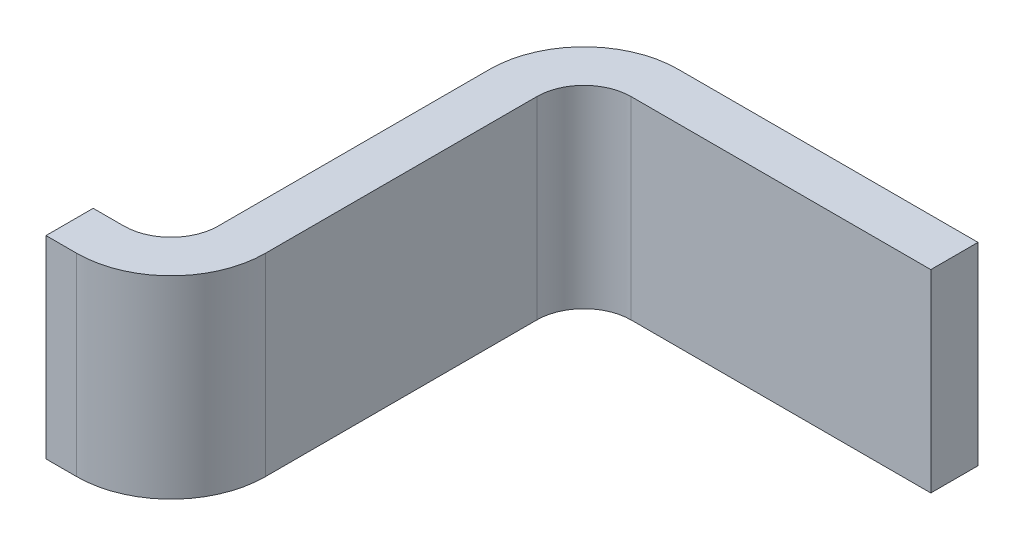
ISO-10303-21;
HEADER;
FILE_DESCRIPTION(('STEP AP214'),'2;1');
FILE_NAME('part.step','',(''),(''),'','','');
FILE_SCHEMA(('AUTOMOTIVE_DESIGN { 1 0 10303 214 1 1 1 1 }'));
ENDSEC;
DATA;
#1=APPLICATION_CONTEXT('core data for automotive mechanical design processes');
#2=APPLICATION_PROTOCOL_DEFINITION('international standard','automotive_design',2000,#1);
#3=PRODUCT_CONTEXT('',#1,'mechanical');
#4=PRODUCT('Part','Part','',(#3));
#5=PRODUCT_RELATED_PRODUCT_CATEGORY('part','',(#4));
#6=PRODUCT_DEFINITION_FORMATION('','',#4);
#7=PRODUCT_DEFINITION_CONTEXT('part definition',#1,'design');
#8=PRODUCT_DEFINITION('design','',#6,#7);
#9=PRODUCT_DEFINITION_SHAPE('','',#8);
#10=(LENGTH_UNIT() NAMED_UNIT(*) SI_UNIT(.MILLI.,.METRE.));
#11=(NAMED_UNIT(*) PLANE_ANGLE_UNIT() SI_UNIT($,.RADIAN.));
#12=(NAMED_UNIT(*) SI_UNIT($,.STERADIAN.) SOLID_ANGLE_UNIT());
#13=UNCERTAINTY_MEASURE_WITH_UNIT(LENGTH_MEASURE(1.E-05),#10,'distance_accuracy_value','');
#14=(GEOMETRIC_REPRESENTATION_CONTEXT(3) GLOBAL_UNCERTAINTY_ASSIGNED_CONTEXT((#13)) GLOBAL_UNIT_ASSIGNED_CONTEXT((#10,
#11,#12)) REPRESENTATION_CONTEXT('',''));
#15=CARTESIAN_POINT('',(0.,0.,0.));
#16=DIRECTION('',(0.,0.,1.));
#17=DIRECTION('',(1.,0.,0.));
#18=AXIS2_PLACEMENT_3D('',#15,#16,#17);
#19=CARTESIAN_POINT('',(0.,0.205,0.975));
#20=DIRECTION('',(0.,0.,-1.));
#21=DIRECTION('',(-1.,0.,0.));
#22=AXIS2_PLACEMENT_3D('',#19,#20,#21);
#23=PLANE('',#22);
#24=DIRECTION('',(1.,0.,0.));
#25=VECTOR('',#24,1.);
#26=CARTESIAN_POINT('',(0.,0.205,0.975));
#27=LINE('',#26,#25);
#28=CARTESIAN_POINT('',(0.065,0.205,0.975));
#29=VERTEX_POINT('',#28);
#30=CARTESIAN_POINT('',(0.,0.205,0.975));
#31=VERTEX_POINT('',#30);
#32=EDGE_CURVE('E104',#29,#31,#27,.F.);
#33=ORIENTED_EDGE('',*,*,#32,.T.);
#34=DIRECTION('',(0.,1.,0.));
#35=VECTOR('',#34,1.);
#36=CARTESIAN_POINT('',(0.,-0.205,0.975));
#37=LINE('',#36,#35);
#38=CARTESIAN_POINT('',(0.,-0.205,0.975));
#39=VERTEX_POINT('',#38);
#40=EDGE_CURVE('E113',#39,#31,#37,.T.);
#41=ORIENTED_EDGE('',*,*,#40,.F.);
#42=DIRECTION('',(1.,0.,0.));
#43=VECTOR('',#42,1.);
#44=CARTESIAN_POINT('',(0.,-0.205,0.975));
#45=LINE('',#44,#43);
#46=CARTESIAN_POINT('',(0.065,-0.205,0.975));
#47=VERTEX_POINT('',#46);
#48=EDGE_CURVE('E118',#39,#47,#45,.T.);
#49=ORIENTED_EDGE('',*,*,#48,.T.);
#50=DIRECTION('',(0.,1.,0.));
#51=VECTOR('',#50,1.);
#52=CARTESIAN_POINT('',(0.065,0.205,0.975));
#53=LINE('',#52,#51);
#54=EDGE_CURVE('E116',#29,#47,#53,.F.);
#55=ORIENTED_EDGE('',*,*,#54,.F.);
#56=EDGE_LOOP('',(#33,#41,#49,#55));
#57=FACE_BOUND('',#56,.T.);
#58=ADVANCED_FACE('F17',(#57),#23,.F.);
#59=CARTESIAN_POINT('',(0.,-0.205,0.875));
#60=DIRECTION('',(-1.,0.,0.));
#61=DIRECTION('',(0.,0.,1.));
#62=AXIS2_PLACEMENT_3D('',#59,#60,#61);
#63=PLANE('',#62);
#64=DIRECTION('',(0.,0.,1.));
#65=VECTOR('',#64,1.);
#66=CARTESIAN_POINT('',(0.,0.205,0.875));
#67=LINE('',#66,#65);
#68=CARTESIAN_POINT('',(0.,0.205,0.875));
#69=VERTEX_POINT('',#68);
#70=EDGE_CURVE('E111',#31,#69,#67,.F.);
#71=ORIENTED_EDGE('',*,*,#70,.T.);
#72=DIRECTION('',(0.,1.,0.));
#73=VECTOR('',#72,1.);
#74=CARTESIAN_POINT('',(0.,-0.205,0.875));
#75=LINE('',#74,#73);
#76=CARTESIAN_POINT('',(0.,-0.205,0.875));
#77=VERTEX_POINT('',#76);
#78=EDGE_CURVE('E127',#69,#77,#75,.F.);
#79=ORIENTED_EDGE('',*,*,#78,.T.);
#80=DIRECTION('',(0.,0.,1.));
#81=VECTOR('',#80,1.);
#82=CARTESIAN_POINT('',(0.,-0.205,0.975));
#83=LINE('',#82,#81);
#84=EDGE_CURVE('E140',#77,#39,#83,.T.);
#85=ORIENTED_EDGE('',*,*,#84,.T.);
#86=ORIENTED_EDGE('',*,*,#40,.T.);
#87=EDGE_LOOP('',(#71,#79,#85,#86));
#88=FACE_BOUND('',#87,.T.);
#89=ADVANCED_FACE('F277',(#88),#63,.T.);
#90=CARTESIAN_POINT('',(0.065,0.205,0.775));
#91=DIRECTION('',(0.,1.,0.));
#92=DIRECTION('',(0.,0.,1.));
#93=AXIS2_PLACEMENT_3D('',#90,#91,#92);
#94=CYLINDRICAL_SURFACE('',#93,0.2);
#95=CARTESIAN_POINT('',(0.065,0.205,0.775));
#96=DIRECTION('',(0.,1.,0.));
#97=DIRECTION('',(0.,0.,1.));
#98=AXIS2_PLACEMENT_3D('',#95,#96,#97);
#99=CIRCLE('',#98,0.2);
#100=CARTESIAN_POINT('',(0.265,0.205,0.775));
#101=VERTEX_POINT('',#100);
#102=EDGE_CURVE('E20',#29,#101,#99,.T.);
#103=ORIENTED_EDGE('',*,*,#102,.F.);
#104=ORIENTED_EDGE('',*,*,#54,.T.);
#105=CARTESIAN_POINT('',(0.065,-0.205,0.775));
#106=DIRECTION('',(0.,1.,0.));
#107=DIRECTION('',(0.,0.,1.));
#108=AXIS2_PLACEMENT_3D('',#105,#106,#107);
#109=CIRCLE('',#108,0.2);
#110=CARTESIAN_POINT('',(0.265,-0.205,0.775));
#111=VERTEX_POINT('',#110);
#112=EDGE_CURVE('E178',#111,#47,#109,.F.);
#113=ORIENTED_EDGE('',*,*,#112,.F.);
#114=DIRECTION('',(0.,1.,0.));
#115=VECTOR('',#114,1.);
#116=CARTESIAN_POINT('',(0.265,0.205,0.775));
#117=LINE('',#116,#115);
#118=EDGE_CURVE('E124',#111,#101,#117,.T.);
#119=ORIENTED_EDGE('',*,*,#118,.T.);
#120=EDGE_LOOP('',(#103,#104,#113,#119));
#121=FACE_BOUND('',#120,.T.);
#122=ADVANCED_FACE('F123',(#121),#94,.T.);
#123=CARTESIAN_POINT('',(0.,-0.205,0.875));
#124=DIRECTION('',(0.,0.,1.));
#125=DIRECTION('',(1.,0.,0.));
#126=AXIS2_PLACEMENT_3D('',#123,#124,#125);
#127=PLANE('',#126);
#128=DIRECTION('',(1.,0.,0.));
#129=VECTOR('',#128,1.);
#130=CARTESIAN_POINT('',(0.,-0.205,0.875));
#131=LINE('',#130,#129);
#132=CARTESIAN_POINT('',(0.065,-0.205,0.875));
#133=VERTEX_POINT('',#132);
#134=EDGE_CURVE('E131',#77,#133,#131,.T.);
#135=ORIENTED_EDGE('',*,*,#134,.F.);
#136=ORIENTED_EDGE('',*,*,#78,.F.);
#137=DIRECTION('',(1.,0.,0.));
#138=VECTOR('',#137,1.);
#139=CARTESIAN_POINT('',(0.,0.205,0.875));
#140=LINE('',#139,#138);
#141=CARTESIAN_POINT('',(0.065,0.205,0.875));
#142=VERTEX_POINT('',#141);
#143=EDGE_CURVE('E126',#142,#69,#140,.F.);
#144=ORIENTED_EDGE('',*,*,#143,.F.);
#145=DIRECTION('',(0.,1.,0.));
#146=VECTOR('',#145,1.);
#147=CARTESIAN_POINT('',(0.065,-0.205,0.875));
#148=LINE('',#147,#146);
#149=EDGE_CURVE('E175',#142,#133,#148,.F.);
#150=ORIENTED_EDGE('',*,*,#149,.T.);
#151=EDGE_LOOP('',(#135,#136,#144,#150));
#152=FACE_BOUND('',#151,.T.);
#153=ADVANCED_FACE('F271',(#152),#127,.F.);
#154=CARTESIAN_POINT('',(0.265,0.205,0.775));
#155=DIRECTION('',(-1.,0.,0.));
#156=DIRECTION('',(0.,0.,1.));
#157=AXIS2_PLACEMENT_3D('',#154,#155,#156);
#158=PLANE('',#157);
#159=DIRECTION('',(0.,0.,-1.));
#160=VECTOR('',#159,1.);
#161=CARTESIAN_POINT('',(0.265,0.205,0.775));
#162=LINE('',#161,#160);
#163=CARTESIAN_POINT('',(0.265,0.205,0.2));
#164=VERTEX_POINT('',#163);
#165=EDGE_CURVE('E177',#164,#101,#162,.F.);
#166=ORIENTED_EDGE('',*,*,#165,.T.);
#167=ORIENTED_EDGE('',*,*,#118,.F.);
#168=DIRECTION('',(0.,0.,1.));
#169=VECTOR('',#168,1.);
#170=CARTESIAN_POINT('',(0.265,-0.205,0.775));
#171=LINE('',#170,#169);
#172=CARTESIAN_POINT('',(0.265,-0.205,0.2));
#173=VERTEX_POINT('',#172);
#174=EDGE_CURVE('E174',#111,#173,#171,.F.);
#175=ORIENTED_EDGE('',*,*,#174,.T.);
#176=DIRECTION('',(0.,-1.,0.));
#177=VECTOR('',#176,1.);
#178=CARTESIAN_POINT('',(0.265,0.205,0.2));
#179=LINE('',#178,#177);
#180=EDGE_CURVE('E171',#173,#164,#179,.F.);
#181=ORIENTED_EDGE('',*,*,#180,.T.);
#182=EDGE_LOOP('',(#166,#167,#175,#181));
#183=FACE_BOUND('',#182,.T.);
#184=ADVANCED_FACE('F267',(#183),#158,.F.);
#185=CARTESIAN_POINT('',(0.065,-0.205,0.775));
#186=DIRECTION('',(0.,1.,0.));
#187=DIRECTION('',(0.,0.,1.));
#188=AXIS2_PLACEMENT_3D('',#185,#186,#187);
#189=CYLINDRICAL_SURFACE('',#188,0.1);
#190=CARTESIAN_POINT('',(0.065,-0.205,0.775));
#191=DIRECTION('',(0.,1.,0.));
#192=DIRECTION('',(0.,0.,1.));
#193=AXIS2_PLACEMENT_3D('',#190,#191,#192);
#194=CIRCLE('',#193,0.1);
#195=CARTESIAN_POINT('',(0.165,-0.205,0.775));
#196=VERTEX_POINT('',#195);
#197=EDGE_CURVE('E172',#133,#196,#194,.T.);
#198=ORIENTED_EDGE('',*,*,#197,.F.);
#199=ORIENTED_EDGE('',*,*,#149,.F.);
#200=CARTESIAN_POINT('',(0.065,0.205,0.775));
#201=DIRECTION('',(0.,1.,0.));
#202=DIRECTION('',(0.,0.,1.));
#203=AXIS2_PLACEMENT_3D('',#200,#201,#202);
#204=CIRCLE('',#203,0.1);
#205=CARTESIAN_POINT('',(0.165,0.205,0.775));
#206=VERTEX_POINT('',#205);
#207=EDGE_CURVE('E176',#206,#142,#204,.F.);
#208=ORIENTED_EDGE('',*,*,#207,.F.);
#209=DIRECTION('',(0.,1.,0.));
#210=VECTOR('',#209,1.);
#211=CARTESIAN_POINT('',(0.165,-0.205,0.775));
#212=LINE('',#211,#210);
#213=EDGE_CURVE('E188',#206,#196,#212,.F.);
#214=ORIENTED_EDGE('',*,*,#213,.T.);
#215=EDGE_LOOP('',(#198,#199,#208,#214));
#216=FACE_BOUND('',#215,.T.);
#217=ADVANCED_FACE('F263',(#216),#189,.F.);
#218=CARTESIAN_POINT('',(0.365,0.205,0.2));
#219=DIRECTION('',(0.,-1.,0.));
#220=DIRECTION('',(0.,0.,-1.));
#221=AXIS2_PLACEMENT_3D('',#218,#219,#220);
#222=CYLINDRICAL_SURFACE('',#221,0.1);
#223=CARTESIAN_POINT('',(0.365,0.205,0.2));
#224=DIRECTION('',(0.,-1.,0.));
#225=DIRECTION('',(0.,0.,-1.));
#226=AXIS2_PLACEMENT_3D('',#223,#224,#225);
#227=CIRCLE('',#226,0.1);
#228=CARTESIAN_POINT('',(0.365,0.205,0.1));
#229=VERTEX_POINT('',#228);
#230=EDGE_CURVE('E168',#164,#229,#227,.T.);
#231=ORIENTED_EDGE('',*,*,#230,.F.);
#232=ORIENTED_EDGE('',*,*,#180,.F.);
#233=CARTESIAN_POINT('',(0.365,-0.205,0.2));
#234=DIRECTION('',(0.,-1.,0.));
#235=DIRECTION('',(0.,0.,-1.));
#236=AXIS2_PLACEMENT_3D('',#233,#234,#235);
#237=CIRCLE('',#236,0.1);
#238=CARTESIAN_POINT('',(0.365,-0.205,0.1));
#239=VERTEX_POINT('',#238);
#240=EDGE_CURVE('E163',#239,#173,#237,.F.);
#241=ORIENTED_EDGE('',*,*,#240,.F.);
#242=DIRECTION('',(0.,1.,0.));
#243=VECTOR('',#242,1.);
#244=CARTESIAN_POINT('',(0.365,0.205,0.1));
#245=LINE('',#244,#243);
#246=EDGE_CURVE('E166',#239,#229,#245,.T.);
#247=ORIENTED_EDGE('',*,*,#246,.T.);
#248=EDGE_LOOP('',(#231,#232,#241,#247));
#249=FACE_BOUND('',#248,.T.);
#250=ADVANCED_FACE('F259',(#249),#222,.F.);
#251=CARTESIAN_POINT('',(0.165,-0.205,0.775));
#252=DIRECTION('',(1.,0.,0.));
#253=DIRECTION('',(0.,0.,-1.));
#254=AXIS2_PLACEMENT_3D('',#251,#252,#253);
#255=PLANE('',#254);
#256=DIRECTION('',(0.,0.,-1.));
#257=VECTOR('',#256,1.);
#258=CARTESIAN_POINT('',(0.165,-0.205,0.775));
#259=LINE('',#258,#257);
#260=CARTESIAN_POINT('',(0.165,-0.205,0.2));
#261=VERTEX_POINT('',#260);
#262=EDGE_CURVE('E167',#196,#261,#259,.T.);
#263=ORIENTED_EDGE('',*,*,#262,.F.);
#264=ORIENTED_EDGE('',*,*,#213,.F.);
#265=DIRECTION('',(0.,0.,-1.));
#266=VECTOR('',#265,1.);
#267=CARTESIAN_POINT('',(0.165,0.205,0.775));
#268=LINE('',#267,#266);
#269=CARTESIAN_POINT('',(0.165,0.205,0.2));
#270=VERTEX_POINT('',#269);
#271=EDGE_CURVE('E170',#270,#206,#268,.F.);
#272=ORIENTED_EDGE('',*,*,#271,.F.);
#273=DIRECTION('',(0.,-1.,0.));
#274=VECTOR('',#273,1.);
#275=CARTESIAN_POINT('',(0.165,-0.205,0.2));
#276=LINE('',#275,#274);
#277=EDGE_CURVE('E159',#261,#270,#276,.F.);
#278=ORIENTED_EDGE('',*,*,#277,.F.);
#279=EDGE_LOOP('',(#263,#264,#272,#278));
#280=FACE_BOUND('',#279,.T.);
#281=ADVANCED_FACE('F255',(#280),#255,.F.);
#282=CARTESIAN_POINT('',(0.365,0.205,0.1));
#283=DIRECTION('',(0.,0.,-1.));
#284=DIRECTION('',(-1.,0.,0.));
#285=AXIS2_PLACEMENT_3D('',#282,#283,#284);
#286=PLANE('',#285);
#287=DIRECTION('',(1.,0.,0.));
#288=VECTOR('',#287,1.);
#289=CARTESIAN_POINT('',(0.365,0.205,0.1));
#290=LINE('',#289,#288);
#291=CARTESIAN_POINT('',(1.,0.205,0.1));
#292=VERTEX_POINT('',#291);
#293=EDGE_CURVE('E162',#292,#229,#290,.F.);
#294=ORIENTED_EDGE('',*,*,#293,.T.);
#295=ORIENTED_EDGE('',*,*,#246,.F.);
#296=DIRECTION('',(1.,0.,0.));
#297=VECTOR('',#296,1.);
#298=CARTESIAN_POINT('',(0.365,-0.205,0.1));
#299=LINE('',#298,#297);
#300=CARTESIAN_POINT('',(1.,-0.205,0.1));
#301=VERTEX_POINT('',#300);
#302=EDGE_CURVE('E216',#239,#301,#299,.T.);
#303=ORIENTED_EDGE('',*,*,#302,.T.);
#304=DIRECTION('',(0.,1.,0.));
#305=VECTOR('',#304,1.);
#306=CARTESIAN_POINT('',(1.,-0.205,0.1));
#307=LINE('',#306,#305);
#308=EDGE_CURVE('E197',#301,#292,#307,.T.);
#309=ORIENTED_EDGE('',*,*,#308,.T.);
#310=EDGE_LOOP('',(#294,#295,#303,#309));
#311=FACE_BOUND('',#310,.T.);
#312=ADVANCED_FACE('F252',(#311),#286,.F.);
#313=CARTESIAN_POINT('',(0.365,0.205,0.));
#314=DIRECTION('',(0.,-1.,0.));
#315=DIRECTION('',(0.,0.,-1.));
#316=AXIS2_PLACEMENT_3D('',#313,#314,#315);
#317=PLANE('',#316);
#318=DIRECTION('',(1.,0.,0.));
#319=VECTOR('',#318,1.);
#320=CARTESIAN_POINT('',(0.365,0.205,0.));
#321=LINE('',#320,#319);
#322=CARTESIAN_POINT('',(1.,0.205,0.));
#323=VERTEX_POINT('',#322);
#324=CARTESIAN_POINT('',(0.365,0.205,0.));
#325=VERTEX_POINT('',#324);
#326=EDGE_CURVE('E205',#323,#325,#321,.F.);
#327=ORIENTED_EDGE('',*,*,#326,.T.);
#328=CARTESIAN_POINT('',(0.365,0.205,0.2));
#329=DIRECTION('',(0.,-1.,0.));
#330=DIRECTION('',(0.,0.,-1.));
#331=AXIS2_PLACEMENT_3D('',#328,#329,#330);
#332=CIRCLE('',#331,0.2);
#333=EDGE_CURVE('E160',#270,#325,#332,.T.);
#334=ORIENTED_EDGE('',*,*,#333,.F.);
#335=ORIENTED_EDGE('',*,*,#271,.T.);
#336=ORIENTED_EDGE('',*,*,#207,.T.);
#337=ORIENTED_EDGE('',*,*,#143,.T.);
#338=ORIENTED_EDGE('',*,*,#70,.F.);
#339=ORIENTED_EDGE('',*,*,#32,.F.);
#340=ORIENTED_EDGE('',*,*,#102,.T.);
#341=ORIENTED_EDGE('',*,*,#165,.F.);
#342=ORIENTED_EDGE('',*,*,#230,.T.);
#343=ORIENTED_EDGE('',*,*,#293,.F.);
#344=DIRECTION('',(0.,0.,1.));
#345=VECTOR('',#344,1.);
#346=CARTESIAN_POINT('',(1.,0.205,0.));
#347=LINE('',#346,#345);
#348=EDGE_CURVE('E200',#292,#323,#347,.F.);
#349=ORIENTED_EDGE('',*,*,#348,.T.);
#350=EDGE_LOOP('',(#327,#334,#335,#336,#337,#338,#339,#340,#341,#342,#343,#349));
#351=FACE_BOUND('',#350,.T.);
#352=ADVANCED_FACE('F107',(#351),#317,.F.);
#353=CARTESIAN_POINT('',(0.365,-0.205,0.2));
#354=DIRECTION('',(0.,-1.,0.));
#355=DIRECTION('',(0.,0.,-1.));
#356=AXIS2_PLACEMENT_3D('',#353,#354,#355);
#357=CYLINDRICAL_SURFACE('',#356,0.2);
#358=CARTESIAN_POINT('',(0.365,-0.205,0.2));
#359=DIRECTION('',(0.,-1.,0.));
#360=DIRECTION('',(0.,0.,-1.));
#361=AXIS2_PLACEMENT_3D('',#358,#359,#360);
#362=CIRCLE('',#361,0.2);
#363=CARTESIAN_POINT('',(0.365,-0.205,0.));
#364=VERTEX_POINT('',#363);
#365=EDGE_CURVE('E157',#364,#261,#362,.F.);
#366=ORIENTED_EDGE('',*,*,#365,.T.);
#367=ORIENTED_EDGE('',*,*,#277,.T.);
#368=ORIENTED_EDGE('',*,*,#333,.T.);
#369=DIRECTION('',(0.,1.,0.));
#370=VECTOR('',#369,1.);
#371=CARTESIAN_POINT('',(0.365,-0.205,0.));
#372=LINE('',#371,#370);
#373=EDGE_CURVE('E211',#325,#364,#372,.F.);
#374=ORIENTED_EDGE('',*,*,#373,.T.);
#375=EDGE_LOOP('',(#366,#367,#368,#374));
#376=FACE_BOUND('',#375,.T.);
#377=ADVANCED_FACE('F233',(#376),#357,.T.);
#378=CARTESIAN_POINT('',(0.365,-0.205,0.1));
#379=DIRECTION('',(0.,1.,0.));
#380=DIRECTION('',(0.,0.,1.));
#381=AXIS2_PLACEMENT_3D('',#378,#379,#380);
#382=PLANE('',#381);
#383=ORIENTED_EDGE('',*,*,#302,.F.);
#384=ORIENTED_EDGE('',*,*,#240,.T.);
#385=ORIENTED_EDGE('',*,*,#174,.F.);
#386=ORIENTED_EDGE('',*,*,#112,.T.);
#387=ORIENTED_EDGE('',*,*,#48,.F.);
#388=ORIENTED_EDGE('',*,*,#84,.F.);
#389=ORIENTED_EDGE('',*,*,#134,.T.);
#390=ORIENTED_EDGE('',*,*,#197,.T.);
#391=ORIENTED_EDGE('',*,*,#262,.T.);
#392=ORIENTED_EDGE('',*,*,#365,.F.);
#393=DIRECTION('',(1.,0.,0.));
#394=VECTOR('',#393,1.);
#395=CARTESIAN_POINT('',(0.365,-0.205,0.));
#396=LINE('',#395,#394);
#397=CARTESIAN_POINT('',(1.,-0.205,0.));
#398=VERTEX_POINT('',#397);
#399=EDGE_CURVE('E26',#364,#398,#396,.T.);
#400=ORIENTED_EDGE('',*,*,#399,.T.);
#401=DIRECTION('',(0.,0.,1.));
#402=VECTOR('',#401,1.);
#403=CARTESIAN_POINT('',(1.,-0.205,0.));
#404=LINE('',#403,#402);
#405=EDGE_CURVE('E34',#398,#301,#404,.T.);
#406=ORIENTED_EDGE('',*,*,#405,.T.);
#407=EDGE_LOOP('',(#383,#384,#385,#386,#387,#388,#389,#390,#391,#392,#400,#406));
#408=FACE_BOUND('',#407,.T.);
#409=ADVANCED_FACE('F227',(#408),#382,.F.);
#410=CARTESIAN_POINT('',(1.,-0.205,0.));
#411=DIRECTION('',(-1.,0.,0.));
#412=DIRECTION('',(0.,0.,1.));
#413=AXIS2_PLACEMENT_3D('',#410,#411,#412);
#414=PLANE('',#413);
#415=ORIENTED_EDGE('',*,*,#348,.F.);
#416=ORIENTED_EDGE('',*,*,#308,.F.);
#417=ORIENTED_EDGE('',*,*,#405,.F.);
#418=DIRECTION('',(0.,1.,0.));
#419=VECTOR('',#418,1.);
#420=CARTESIAN_POINT('',(1.,-0.205,0.));
#421=LINE('',#420,#419);
#422=EDGE_CURVE('E11',#398,#323,#421,.T.);
#423=ORIENTED_EDGE('',*,*,#422,.T.);
#424=EDGE_LOOP('',(#415,#416,#417,#423));
#425=FACE_BOUND('',#424,.T.);
#426=ADVANCED_FACE('F237',(#425),#414,.F.);
#427=CARTESIAN_POINT('',(0.365,-0.205,0.));
#428=DIRECTION('',(0.,0.,1.));
#429=DIRECTION('',(1.,0.,0.));
#430=AXIS2_PLACEMENT_3D('',#427,#428,#429);
#431=PLANE('',#430);
#432=ORIENTED_EDGE('',*,*,#399,.F.);
#433=ORIENTED_EDGE('',*,*,#373,.F.);
#434=ORIENTED_EDGE('',*,*,#326,.F.);
#435=ORIENTED_EDGE('',*,*,#422,.F.);
#436=EDGE_LOOP('',(#432,#433,#434,#435));
#437=FACE_BOUND('',#436,.T.);
#438=ADVANCED_FACE('F231',(#437),#431,.F.);
#439=CLOSED_SHELL('',(#58,#89,#122,#153,#184,#217,#250,#281,#312,#352,#377,#409,#426,#438));
#440=MANIFOLD_SOLID_BREP('B1',#439);
#441=ADVANCED_BREP_SHAPE_REPRESENTATION('',(#18,#440),#14);
#442=SHAPE_DEFINITION_REPRESENTATION(#9,#441);
ENDSEC;
END-ISO-10303-21;
